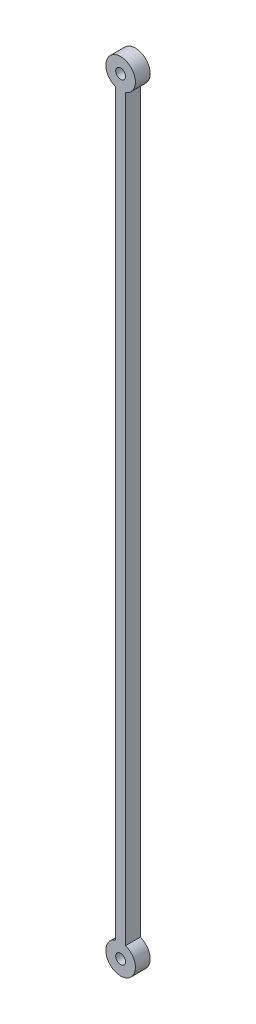
ISO-10303-21;
HEADER;
FILE_DESCRIPTION(('STEP AP214'),'2;1');
FILE_NAME('part.step','',(''),(''),'','','');
FILE_SCHEMA(('AUTOMOTIVE_DESIGN { 1 0 10303 214 1 1 1 1 }'));
ENDSEC;
DATA;
#1=APPLICATION_CONTEXT('core data for automotive mechanical design processes');
#2=APPLICATION_PROTOCOL_DEFINITION('international standard','automotive_design',2000,#1);
#3=PRODUCT_CONTEXT('',#1,'mechanical');
#4=PRODUCT('Part','Part','',(#3));
#5=PRODUCT_RELATED_PRODUCT_CATEGORY('part','',(#4));
#6=PRODUCT_DEFINITION_FORMATION('','',#4);
#7=PRODUCT_DEFINITION_CONTEXT('part definition',#1,'design');
#8=PRODUCT_DEFINITION('design','',#6,#7);
#9=PRODUCT_DEFINITION_SHAPE('','',#8);
#10=(LENGTH_UNIT() NAMED_UNIT(*) SI_UNIT(.MILLI.,.METRE.));
#11=(NAMED_UNIT(*) PLANE_ANGLE_UNIT() SI_UNIT($,.RADIAN.));
#12=(NAMED_UNIT(*) SI_UNIT($,.STERADIAN.) SOLID_ANGLE_UNIT());
#13=UNCERTAINTY_MEASURE_WITH_UNIT(LENGTH_MEASURE(1.E-05),#10,'distance_accuracy_value','');
#14=(GEOMETRIC_REPRESENTATION_CONTEXT(3) GLOBAL_UNCERTAINTY_ASSIGNED_CONTEXT((#13)) GLOBAL_UNIT_ASSIGNED_CONTEXT((#10,
#11,#12)) REPRESENTATION_CONTEXT('',''));
#15=CARTESIAN_POINT('',(0.,0.,0.));
#16=DIRECTION('',(0.,0.,1.));
#17=DIRECTION('',(1.,0.,0.));
#18=AXIS2_PLACEMENT_3D('',#15,#16,#17);
#19=CARTESIAN_POINT('',(0.,0.,0.));
#20=DIRECTION('',(0.,0.,1.));
#21=DIRECTION('',(1.,0.,0.));
#22=AXIS2_PLACEMENT_3D('',#19,#20,#21);
#23=PLANE('',#22);
#24=CARTESIAN_POINT('',(0.,0.,0.));
#25=DIRECTION('',(0.,0.,1.));
#26=DIRECTION('',(1.,0.,0.));
#27=AXIS2_PLACEMENT_3D('',#24,#25,#26);
#28=CIRCLE('',#27,1.);
#29=CARTESIAN_POINT('',(1.,0.,0.));
#30=VERTEX_POINT('',#29);
#31=EDGE_CURVE('E157',#30,#30,#28,.T.);
#32=ORIENTED_EDGE('',*,*,#31,.T.);
#33=EDGE_LOOP('',(#32));
#34=FACE_BOUND('',#33,.T.);
#35=CARTESIAN_POINT('',(0.,155.656854249492,0.));
#36=DIRECTION('',(0.,0.,1.));
#37=DIRECTION('',(1.,0.,0.));
#38=AXIS2_PLACEMENT_3D('',#35,#36,#37);
#39=CIRCLE('',#38,1.);
#40=CARTESIAN_POINT('',(0.999999999999976,155.656854249492,0.));
#41=VERTEX_POINT('',#40);
#42=EDGE_CURVE('E170',#41,#41,#39,.T.);
#43=ORIENTED_EDGE('',*,*,#42,.T.);
#44=EDGE_LOOP('',(#43));
#45=FACE_BOUND('',#44,.T.);
#46=CARTESIAN_POINT('',(0.,0.,0.));
#47=DIRECTION('',(0.,0.,1.));
#48=DIRECTION('',(1.,0.,0.));
#49=AXIS2_PLACEMENT_3D('',#46,#47,#48);
#50=CIRCLE('',#49,3.);
#51=CARTESIAN_POINT('',(-1.,2.82842712474619,0.));
#52=VERTEX_POINT('',#51);
#53=CARTESIAN_POINT('',(1.,2.82842712474619,0.));
#54=VERTEX_POINT('',#53);
#55=EDGE_CURVE('E147',#52,#54,#50,.T.);
#56=ORIENTED_EDGE('',*,*,#55,.F.);
#57=DIRECTION('',(0.,1.,0.));
#58=VECTOR('',#57,1.);
#59=CARTESIAN_POINT('',(-1.,0.,0.));
#60=LINE('',#59,#58);
#61=CARTESIAN_POINT('',(-1.00000000000002,152.828427124746,0.));
#62=VERTEX_POINT('',#61);
#63=EDGE_CURVE('E134',#52,#62,#60,.T.);
#64=ORIENTED_EDGE('',*,*,#63,.T.);
#65=CARTESIAN_POINT('',(0.,155.656854249492,0.));
#66=DIRECTION('',(0.,0.,1.));
#67=DIRECTION('',(1.,0.,0.));
#68=AXIS2_PLACEMENT_3D('',#65,#66,#67);
#69=CIRCLE('',#68,3.);
#70=CARTESIAN_POINT('',(0.999999999999982,152.828427124746,0.));
#71=VERTEX_POINT('',#70);
#72=EDGE_CURVE('E139',#71,#62,#69,.T.);
#73=ORIENTED_EDGE('',*,*,#72,.F.);
#74=DIRECTION('',(0.,-1.,0.));
#75=VECTOR('',#74,1.);
#76=CARTESIAN_POINT('',(1.,0.,0.));
#77=LINE('',#76,#75);
#78=EDGE_CURVE('E145',#71,#54,#77,.T.);
#79=ORIENTED_EDGE('',*,*,#78,.T.);
#80=EDGE_LOOP('',(#56,#64,#73,#79));
#81=FACE_BOUND('',#80,.T.);
#82=ADVANCED_FACE('F87',(#34,#45,#81),#23,.F.);
#83=CARTESIAN_POINT('',(0.,0.,3.));
#84=DIRECTION('',(0.,0.,-1.));
#85=DIRECTION('',(-1.,0.,0.));
#86=AXIS2_PLACEMENT_3D('',#83,#84,#85);
#87=CYLINDRICAL_SURFACE('',#86,3.);
#88=ORIENTED_EDGE('',*,*,#55,.T.);
#89=DIRECTION('',(0.,0.,-1.));
#90=VECTOR('',#89,1.);
#91=CARTESIAN_POINT('',(1.,2.82842712474619,3.));
#92=LINE('',#91,#90);
#93=CARTESIAN_POINT('',(1.,2.82842712474619,3.));
#94=VERTEX_POINT('',#93);
#95=EDGE_CURVE('E98',#94,#54,#92,.T.);
#96=ORIENTED_EDGE('',*,*,#95,.F.);
#97=CARTESIAN_POINT('',(0.,0.,3.));
#98=DIRECTION('',(0.,0.,1.));
#99=DIRECTION('',(1.,0.,0.));
#100=AXIS2_PLACEMENT_3D('',#97,#98,#99);
#101=CIRCLE('',#100,3.);
#102=CARTESIAN_POINT('',(-1.,2.82842712474619,3.));
#103=VERTEX_POINT('',#102);
#104=EDGE_CURVE('E164',#103,#94,#101,.T.);
#105=ORIENTED_EDGE('',*,*,#104,.F.);
#106=DIRECTION('',(0.,0.,-1.));
#107=VECTOR('',#106,1.);
#108=CARTESIAN_POINT('',(-1.,2.82842712474619,3.));
#109=LINE('',#108,#107);
#110=EDGE_CURVE('E12',#103,#52,#109,.T.);
#111=ORIENTED_EDGE('',*,*,#110,.T.);
#112=EDGE_LOOP('',(#88,#96,#105,#111));
#113=FACE_BOUND('',#112,.T.);
#114=ADVANCED_FACE('F198',(#113),#87,.T.);
#115=CARTESIAN_POINT('',(0.,0.,3.));
#116=DIRECTION('',(0.,0.,1.));
#117=DIRECTION('',(1.,0.,0.));
#118=AXIS2_PLACEMENT_3D('',#115,#116,#117);
#119=PLANE('',#118);
#120=CARTESIAN_POINT('',(0.,0.,3.));
#121=DIRECTION('',(0.,0.,1.));
#122=DIRECTION('',(1.,0.,0.));
#123=AXIS2_PLACEMENT_3D('',#120,#121,#122);
#124=CIRCLE('',#123,1.);
#125=CARTESIAN_POINT('',(1.,0.,3.));
#126=VERTEX_POINT('',#125);
#127=EDGE_CURVE('E178',#126,#126,#124,.T.);
#128=ORIENTED_EDGE('',*,*,#127,.F.);
#129=EDGE_LOOP('',(#128));
#130=FACE_BOUND('',#129,.T.);
#131=CARTESIAN_POINT('',(0.,155.656854249492,3.));
#132=DIRECTION('',(0.,0.,1.));
#133=DIRECTION('',(1.,0.,0.));
#134=AXIS2_PLACEMENT_3D('',#131,#132,#133);
#135=CIRCLE('',#134,1.);
#136=CARTESIAN_POINT('',(0.999999999999976,155.656854249492,3.));
#137=VERTEX_POINT('',#136);
#138=EDGE_CURVE('E174',#137,#137,#135,.T.);
#139=ORIENTED_EDGE('',*,*,#138,.F.);
#140=EDGE_LOOP('',(#139));
#141=FACE_BOUND('',#140,.T.);
#142=ORIENTED_EDGE('',*,*,#104,.T.);
#143=DIRECTION('',(0.,-1.,0.));
#144=VECTOR('',#143,1.);
#145=CARTESIAN_POINT('',(1.,0.,3.));
#146=LINE('',#145,#144);
#147=CARTESIAN_POINT('',(0.999999999999982,152.828427124746,3.));
#148=VERTEX_POINT('',#147);
#149=EDGE_CURVE('E149',#148,#94,#146,.T.);
#150=ORIENTED_EDGE('',*,*,#149,.F.);
#151=CARTESIAN_POINT('',(0.,155.656854249492,3.));
#152=DIRECTION('',(0.,0.,1.));
#153=DIRECTION('',(1.,0.,0.));
#154=AXIS2_PLACEMENT_3D('',#151,#152,#153);
#155=CIRCLE('',#154,3.);
#156=CARTESIAN_POINT('',(-1.00000000000002,152.828427124746,3.));
#157=VERTEX_POINT('',#156);
#158=EDGE_CURVE('E152',#148,#157,#155,.T.);
#159=ORIENTED_EDGE('',*,*,#158,.T.);
#160=DIRECTION('',(0.,1.,0.));
#161=VECTOR('',#160,1.);
#162=CARTESIAN_POINT('',(-1.,0.,3.));
#163=LINE('',#162,#161);
#164=EDGE_CURVE('E137',#103,#157,#163,.T.);
#165=ORIENTED_EDGE('',*,*,#164,.F.);
#166=EDGE_LOOP('',(#142,#150,#159,#165));
#167=FACE_BOUND('',#166,.T.);
#168=ADVANCED_FACE('F195',(#130,#141,#167),#119,.T.);
#169=CARTESIAN_POINT('',(0.,155.656854249492,3.));
#170=DIRECTION('',(0.,0.,-1.));
#171=DIRECTION('',(-1.,0.,0.));
#172=AXIS2_PLACEMENT_3D('',#169,#170,#171);
#173=CYLINDRICAL_SURFACE('',#172,3.);
#174=ORIENTED_EDGE('',*,*,#72,.T.);
#175=DIRECTION('',(0.,0.,-1.));
#176=VECTOR('',#175,1.);
#177=CARTESIAN_POINT('',(-1.00000000000002,152.828427124746,3.));
#178=LINE('',#177,#176);
#179=EDGE_CURVE('E131',#157,#62,#178,.T.);
#180=ORIENTED_EDGE('',*,*,#179,.F.);
#181=ORIENTED_EDGE('',*,*,#158,.F.);
#182=DIRECTION('',(0.,0.,-1.));
#183=VECTOR('',#182,1.);
#184=CARTESIAN_POINT('',(0.999999999999982,152.828427124746,3.));
#185=LINE('',#184,#183);
#186=EDGE_CURVE('E91',#148,#71,#185,.T.);
#187=ORIENTED_EDGE('',*,*,#186,.T.);
#188=EDGE_LOOP('',(#174,#180,#181,#187));
#189=FACE_BOUND('',#188,.T.);
#190=ADVANCED_FACE('F140',(#189),#173,.T.);
#191=CARTESIAN_POINT('',(-1.,0.,3.));
#192=DIRECTION('',(-1.,0.,0.));
#193=DIRECTION('',(0.,-1.,0.));
#194=AXIS2_PLACEMENT_3D('',#191,#192,#193);
#195=PLANE('',#194);
#196=ORIENTED_EDGE('',*,*,#63,.F.);
#197=ORIENTED_EDGE('',*,*,#110,.F.);
#198=ORIENTED_EDGE('',*,*,#164,.T.);
#199=ORIENTED_EDGE('',*,*,#179,.T.);
#200=EDGE_LOOP('',(#196,#197,#198,#199));
#201=FACE_BOUND('',#200,.T.);
#202=ADVANCED_FACE('F132',(#201),#195,.T.);
#203=CARTESIAN_POINT('',(1.,0.,3.));
#204=DIRECTION('',(1.,0.,0.));
#205=DIRECTION('',(0.,1.,0.));
#206=AXIS2_PLACEMENT_3D('',#203,#204,#205);
#207=PLANE('',#206);
#208=ORIENTED_EDGE('',*,*,#78,.F.);
#209=ORIENTED_EDGE('',*,*,#186,.F.);
#210=ORIENTED_EDGE('',*,*,#149,.T.);
#211=ORIENTED_EDGE('',*,*,#95,.T.);
#212=EDGE_LOOP('',(#208,#209,#210,#211));
#213=FACE_BOUND('',#212,.T.);
#214=ADVANCED_FACE('F89',(#213),#207,.T.);
#215=CARTESIAN_POINT('',(0.,155.656854249492,0.));
#216=DIRECTION('',(0.,0.,1.));
#217=DIRECTION('',(1.,0.,0.));
#218=AXIS2_PLACEMENT_3D('',#215,#216,#217);
#219=CYLINDRICAL_SURFACE('',#218,1.);
#220=ORIENTED_EDGE('',*,*,#42,.F.);
#221=EDGE_LOOP('',(#220));
#222=FACE_BOUND('',#221,.T.);
#223=ORIENTED_EDGE('',*,*,#138,.T.);
#224=EDGE_LOOP('',(#223));
#225=FACE_BOUND('',#224,.T.);
#226=ADVANCED_FACE('F191',(#222,#225),#219,.F.);
#227=CARTESIAN_POINT('',(0.,0.,0.));
#228=DIRECTION('',(0.,0.,1.));
#229=DIRECTION('',(1.,0.,0.));
#230=AXIS2_PLACEMENT_3D('',#227,#228,#229);
#231=CYLINDRICAL_SURFACE('',#230,1.);
#232=ORIENTED_EDGE('',*,*,#31,.F.);
#233=EDGE_LOOP('',(#232));
#234=FACE_BOUND('',#233,.T.);
#235=ORIENTED_EDGE('',*,*,#127,.T.);
#236=EDGE_LOOP('',(#235));
#237=FACE_BOUND('',#236,.T.);
#238=ADVANCED_FACE('F188',(#234,#237),#231,.F.);
#239=CLOSED_SHELL('',(#82,#114,#168,#190,#202,#214,#226,#238));
#240=MANIFOLD_SOLID_BREP('B2',#239);
#241=ADVANCED_BREP_SHAPE_REPRESENTATION('',(#18,#240),#14);
#242=SHAPE_DEFINITION_REPRESENTATION(#9,#241);
ENDSEC;
END-ISO-10303-21;
